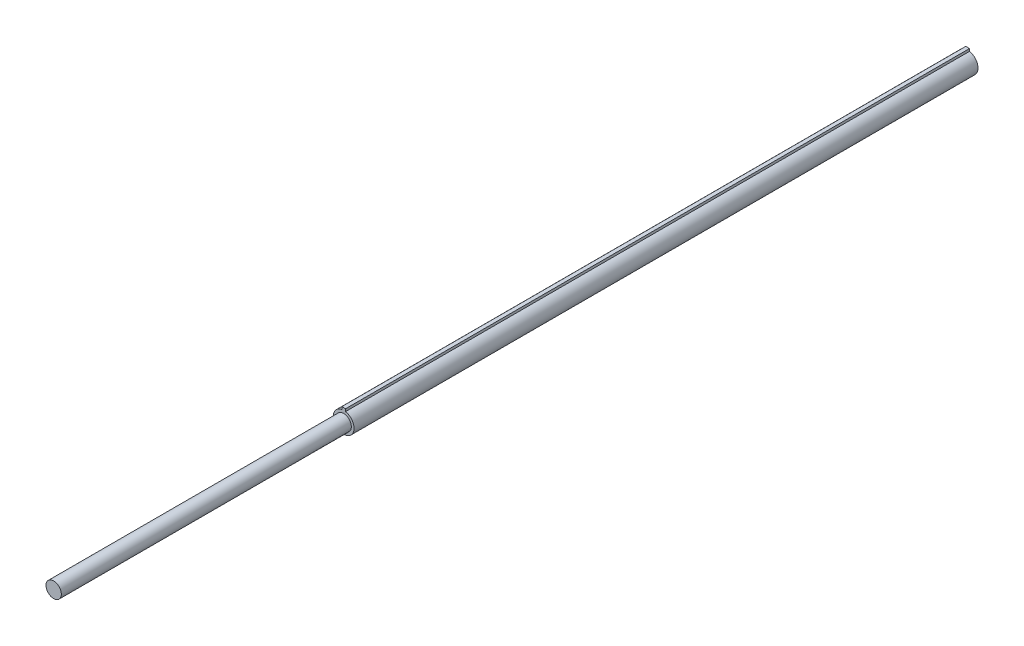
ISO-10303-21;
HEADER;
FILE_DESCRIPTION(('STEP AP214'),'2;1');
FILE_NAME('part.step','',(''),(''),'','','');
FILE_SCHEMA(('AUTOMOTIVE_DESIGN { 1 0 10303 214 1 1 1 1 }'));
ENDSEC;
DATA;
#1=APPLICATION_CONTEXT('core data for automotive mechanical design processes');
#2=APPLICATION_PROTOCOL_DEFINITION('international standard','automotive_design',2000,#1);
#3=PRODUCT_CONTEXT('',#1,'mechanical');
#4=PRODUCT('Part','Part','',(#3));
#5=PRODUCT_RELATED_PRODUCT_CATEGORY('part','',(#4));
#6=PRODUCT_DEFINITION_FORMATION('','',#4);
#7=PRODUCT_DEFINITION_CONTEXT('part definition',#1,'design');
#8=PRODUCT_DEFINITION('design','',#6,#7);
#9=PRODUCT_DEFINITION_SHAPE('','',#8);
#10=(LENGTH_UNIT() NAMED_UNIT(*) SI_UNIT(.MILLI.,.METRE.));
#11=(NAMED_UNIT(*) PLANE_ANGLE_UNIT() SI_UNIT($,.RADIAN.));
#12=(NAMED_UNIT(*) SI_UNIT($,.STERADIAN.) SOLID_ANGLE_UNIT());
#13=UNCERTAINTY_MEASURE_WITH_UNIT(LENGTH_MEASURE(1.E-05),#10,'distance_accuracy_value','');
#14=(GEOMETRIC_REPRESENTATION_CONTEXT(3) GLOBAL_UNCERTAINTY_ASSIGNED_CONTEXT((#13)) GLOBAL_UNIT_ASSIGNED_CONTEXT((#10,
#11,#12)) REPRESENTATION_CONTEXT('',''));
#15=CARTESIAN_POINT('',(0.,0.,0.));
#16=DIRECTION('',(0.,0.,1.));
#17=DIRECTION('',(1.,0.,0.));
#18=AXIS2_PLACEMENT_3D('',#15,#16,#17);
#19=CARTESIAN_POINT('',(-77.6275987335774,118.839525931107,150.6));
#20=DIRECTION('',(0.,0.,-1.));
#21=DIRECTION('',(-1.,0.,0.));
#22=AXIS2_PLACEMENT_3D('',#19,#20,#21);
#23=CYLINDRICAL_SURFACE('',#22,2.49999999999999);
#24=CARTESIAN_POINT('',(-77.6275987335774,118.839525931107,0.));
#25=DIRECTION('',(0.,0.,1.));
#26=DIRECTION('',(1.,0.,0.));
#27=AXIS2_PLACEMENT_3D('',#24,#25,#26);
#28=CIRCLE('',#27,2.49999999999999);
#29=CARTESIAN_POINT('',(-78.0775987335774,121.298692456579,0.));
#30=VERTEX_POINT('',#29);
#31=CARTESIAN_POINT('',(-77.1775987335774,121.298692456579,0.));
#32=VERTEX_POINT('',#31);
#33=EDGE_CURVE('E107',#30,#32,#28,.T.);
#34=ORIENTED_EDGE('',*,*,#33,.T.);
#35=DIRECTION('',(0.,0.,-1.));
#36=VECTOR('',#35,1.);
#37=CARTESIAN_POINT('',(-77.1775987335774,121.298692456579,150.6));
#38=LINE('',#37,#36);
#39=CARTESIAN_POINT('',(-77.1775987335774,121.298692456579,150.6));
#40=VERTEX_POINT('',#39);
#41=EDGE_CURVE('E44',#40,#32,#38,.T.);
#42=ORIENTED_EDGE('',*,*,#41,.F.);
#43=CARTESIAN_POINT('',(-77.6275987335774,118.839525931107,150.6));
#44=DIRECTION('',(0.,0.,1.));
#45=DIRECTION('',(1.,0.,0.));
#46=AXIS2_PLACEMENT_3D('',#43,#44,#45);
#47=CIRCLE('',#46,2.49999999999999);
#48=CARTESIAN_POINT('',(-78.0775987335774,121.298692456579,150.6));
#49=VERTEX_POINT('',#48);
#50=EDGE_CURVE('E94',#49,#40,#47,.T.);
#51=ORIENTED_EDGE('',*,*,#50,.F.);
#52=DIRECTION('',(0.,0.,-1.));
#53=VECTOR('',#52,1.);
#54=CARTESIAN_POINT('',(-78.0775987335774,121.298692456579,150.6));
#55=LINE('',#54,#53);
#56=EDGE_CURVE('E103',#49,#30,#55,.T.);
#57=ORIENTED_EDGE('',*,*,#56,.T.);
#58=EDGE_LOOP('',(#34,#42,#51,#57));
#59=FACE_BOUND('',#58,.T.);
#60=ADVANCED_FACE('F41',(#59),#23,.T.);
#61=CARTESIAN_POINT('',(-77.1775987335774,121.298692456579,150.6));
#62=DIRECTION('',(-1.,0.,0.));
#63=DIRECTION('',(0.,0.,1.));
#64=AXIS2_PLACEMENT_3D('',#61,#62,#63);
#65=PLANE('',#64);
#66=DIRECTION('',(0.,1.,0.));
#67=VECTOR('',#66,1.);
#68=CARTESIAN_POINT('',(-77.1775987335774,121.298692456579,0.));
#69=LINE('',#68,#67);
#70=CARTESIAN_POINT('',(-77.1775987335774,121.898692456579,0.));
#71=VERTEX_POINT('',#70);
#72=EDGE_CURVE('E99',#32,#71,#69,.T.);
#73=ORIENTED_EDGE('',*,*,#72,.T.);
#74=DIRECTION('',(0.,0.,-1.));
#75=VECTOR('',#74,1.);
#76=CARTESIAN_POINT('',(-77.1775987335774,121.898692456579,150.6));
#77=LINE('',#76,#75);
#78=CARTESIAN_POINT('',(-77.1775987335774,121.898692456579,150.6));
#79=VERTEX_POINT('',#78);
#80=EDGE_CURVE('E97',#79,#71,#77,.T.);
#81=ORIENTED_EDGE('',*,*,#80,.F.);
#82=DIRECTION('',(0.,1.,0.));
#83=VECTOR('',#82,1.);
#84=CARTESIAN_POINT('',(-77.1775987335774,121.298692456579,150.6));
#85=LINE('',#84,#83);
#86=EDGE_CURVE('E89',#40,#79,#85,.T.);
#87=ORIENTED_EDGE('',*,*,#86,.F.);
#88=ORIENTED_EDGE('',*,*,#41,.T.);
#89=EDGE_LOOP('',(#73,#81,#87,#88));
#90=FACE_BOUND('',#89,.T.);
#91=ADVANCED_FACE('F98',(#90),#65,.F.);
#92=CARTESIAN_POINT('',(-78.0775987335774,121.898692456579,150.6));
#93=DIRECTION('',(0.,-1.,0.));
#94=DIRECTION('',(0.,0.,-1.));
#95=AXIS2_PLACEMENT_3D('',#92,#93,#94);
#96=PLANE('',#95);
#97=DIRECTION('',(-1.,0.,0.));
#98=VECTOR('',#97,1.);
#99=CARTESIAN_POINT('',(-78.0775987335774,121.898692456579,0.));
#100=LINE('',#99,#98);
#101=CARTESIAN_POINT('',(-78.0775987335774,121.898692456579,0.));
#102=VERTEX_POINT('',#101);
#103=EDGE_CURVE('E75',#71,#102,#100,.T.);
#104=ORIENTED_EDGE('',*,*,#103,.T.);
#105=DIRECTION('',(0.,0.,-1.));
#106=VECTOR('',#105,1.);
#107=CARTESIAN_POINT('',(-78.0775987335774,121.898692456579,150.6));
#108=LINE('',#107,#106);
#109=CARTESIAN_POINT('',(-78.0775987335774,121.898692456579,150.6));
#110=VERTEX_POINT('',#109);
#111=EDGE_CURVE('E100',#110,#102,#108,.T.);
#112=ORIENTED_EDGE('',*,*,#111,.F.);
#113=DIRECTION('',(-1.,0.,0.));
#114=VECTOR('',#113,1.);
#115=CARTESIAN_POINT('',(-78.0775987335774,121.898692456579,150.6));
#116=LINE('',#115,#114);
#117=EDGE_CURVE('E92',#79,#110,#116,.T.);
#118=ORIENTED_EDGE('',*,*,#117,.F.);
#119=ORIENTED_EDGE('',*,*,#80,.T.);
#120=EDGE_LOOP('',(#104,#112,#118,#119));
#121=FACE_BOUND('',#120,.T.);
#122=ADVANCED_FACE('F101',(#121),#96,.F.);
#123=CARTESIAN_POINT('',(-78.0775987335774,121.298692456579,150.6));
#124=DIRECTION('',(1.,0.,0.));
#125=DIRECTION('',(0.,0.,-1.));
#126=AXIS2_PLACEMENT_3D('',#123,#124,#125);
#127=PLANE('',#126);
#128=DIRECTION('',(0.,-1.,0.));
#129=VECTOR('',#128,1.);
#130=CARTESIAN_POINT('',(-78.0775987335774,121.298692456579,0.));
#131=LINE('',#130,#129);
#132=EDGE_CURVE('E81',#102,#30,#131,.T.);
#133=ORIENTED_EDGE('',*,*,#132,.T.);
#134=ORIENTED_EDGE('',*,*,#56,.F.);
#135=DIRECTION('',(0.,-1.,0.));
#136=VECTOR('',#135,1.);
#137=CARTESIAN_POINT('',(-78.0775987335774,121.298692456579,150.6));
#138=LINE('',#137,#136);
#139=EDGE_CURVE('E58',#110,#49,#138,.T.);
#140=ORIENTED_EDGE('',*,*,#139,.F.);
#141=ORIENTED_EDGE('',*,*,#111,.T.);
#142=EDGE_LOOP('',(#133,#134,#140,#141));
#143=FACE_BOUND('',#142,.T.);
#144=ADVANCED_FACE('F115',(#143),#127,.F.);
#145=CARTESIAN_POINT('',(-77.6275987335774,118.839525931107,150.6));
#146=DIRECTION('',(0.,0.,1.));
#147=DIRECTION('',(1.,0.,0.));
#148=AXIS2_PLACEMENT_3D('',#145,#146,#147);
#149=PLANE('',#148);
#150=CARTESIAN_POINT('',(-77.6275987335774,118.839525931107,150.6));
#151=DIRECTION('',(0.,0.,1.));
#152=DIRECTION('',(1.,0.,0.));
#153=AXIS2_PLACEMENT_3D('',#150,#151,#152);
#154=CIRCLE('',#153,1.85000000000001);
#155=CARTESIAN_POINT('',(-75.7775987335774,118.839525931107,150.6));
#156=VERTEX_POINT('',#155);
#157=EDGE_CURVE('E11',#156,#156,#154,.T.);
#158=ORIENTED_EDGE('',*,*,#157,.F.);
#159=EDGE_LOOP('',(#158));
#160=FACE_BOUND('',#159,.T.);
#161=ORIENTED_EDGE('',*,*,#50,.T.);
#162=ORIENTED_EDGE('',*,*,#86,.T.);
#163=ORIENTED_EDGE('',*,*,#117,.T.);
#164=ORIENTED_EDGE('',*,*,#139,.T.);
#165=EDGE_LOOP('',(#161,#162,#163,#164));
#166=FACE_BOUND('',#165,.T.);
#167=ADVANCED_FACE('F90',(#160,#166),#149,.T.);
#168=CARTESIAN_POINT('',(-77.6275987335774,118.839525931107,0.));
#169=DIRECTION('',(0.,0.,1.));
#170=DIRECTION('',(1.,0.,0.));
#171=AXIS2_PLACEMENT_3D('',#168,#169,#170);
#172=PLANE('',#171);
#173=ORIENTED_EDGE('',*,*,#33,.F.);
#174=ORIENTED_EDGE('',*,*,#132,.F.);
#175=ORIENTED_EDGE('',*,*,#103,.F.);
#176=ORIENTED_EDGE('',*,*,#72,.F.);
#177=EDGE_LOOP('',(#173,#174,#175,#176));
#178=FACE_BOUND('',#177,.T.);
#179=ADVANCED_FACE('F118',(#178),#172,.F.);
#180=CARTESIAN_POINT('',(-77.6275987335774,118.839525931107,220.6));
#181=DIRECTION('',(0.,0.,-1.));
#182=DIRECTION('',(-1.,0.,0.));
#183=AXIS2_PLACEMENT_3D('',#180,#181,#182);
#184=CYLINDRICAL_SURFACE('',#183,1.85000000000001);
#185=CARTESIAN_POINT('',(-77.6275987335774,118.839525931107,220.6));
#186=DIRECTION('',(0.,0.,1.));
#187=DIRECTION('',(1.,0.,0.));
#188=AXIS2_PLACEMENT_3D('',#185,#186,#187);
#189=CIRCLE('',#188,1.85000000000001);
#190=CARTESIAN_POINT('',(-75.7775987335774,118.839525931107,220.6));
#191=VERTEX_POINT('',#190);
#192=EDGE_CURVE('E110',#191,#191,#189,.T.);
#193=ORIENTED_EDGE('',*,*,#192,.F.);
#194=EDGE_LOOP('',(#193));
#195=FACE_BOUND('',#194,.T.);
#196=ORIENTED_EDGE('',*,*,#157,.T.);
#197=EDGE_LOOP('',(#196));
#198=FACE_BOUND('',#197,.T.);
#199=ADVANCED_FACE('F126',(#195,#198),#184,.T.);
#200=CARTESIAN_POINT('',(-77.6275987335774,118.839525931107,220.6));
#201=DIRECTION('',(0.,0.,1.));
#202=DIRECTION('',(1.,0.,0.));
#203=AXIS2_PLACEMENT_3D('',#200,#201,#202);
#204=PLANE('',#203);
#205=ORIENTED_EDGE('',*,*,#192,.T.);
#206=EDGE_LOOP('',(#205));
#207=FACE_BOUND('',#206,.T.);
#208=ADVANCED_FACE('F124',(#207),#204,.T.);
#209=CLOSED_SHELL('',(#60,#91,#122,#144,#167,#179,#199,#208));
#210=MANIFOLD_SOLID_BREP('B2',#209);
#211=ADVANCED_BREP_SHAPE_REPRESENTATION('',(#18,#210),#14);
#212=SHAPE_DEFINITION_REPRESENTATION(#9,#211);
ENDSEC;
END-ISO-10303-21;
